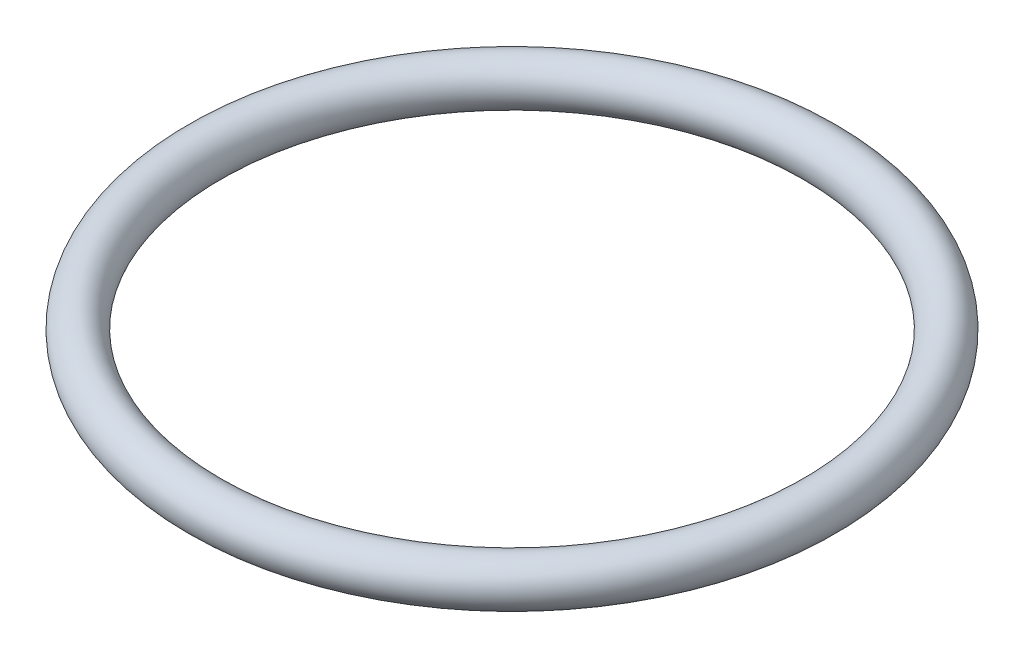
ISO-10303-21;
HEADER;
FILE_DESCRIPTION(('STEP AP214'),'2;1');
FILE_NAME('part.step','',(''),(''),'','','');
FILE_SCHEMA(('AUTOMOTIVE_DESIGN { 1 0 10303 214 1 1 1 1 }'));
ENDSEC;
DATA;
#1=APPLICATION_CONTEXT('core data for automotive mechanical design processes');
#2=APPLICATION_PROTOCOL_DEFINITION('international standard','automotive_design',2000,#1);
#3=PRODUCT_CONTEXT('',#1,'mechanical');
#4=PRODUCT('Part','Part','',(#3));
#5=PRODUCT_RELATED_PRODUCT_CATEGORY('part','',(#4));
#6=PRODUCT_DEFINITION_FORMATION('','',#4);
#7=PRODUCT_DEFINITION_CONTEXT('part definition',#1,'design');
#8=PRODUCT_DEFINITION('design','',#6,#7);
#9=PRODUCT_DEFINITION_SHAPE('','',#8);
#10=(LENGTH_UNIT() NAMED_UNIT(*) SI_UNIT(.MILLI.,.METRE.));
#11=(NAMED_UNIT(*) PLANE_ANGLE_UNIT() SI_UNIT($,.RADIAN.));
#12=(NAMED_UNIT(*) SI_UNIT($,.STERADIAN.) SOLID_ANGLE_UNIT());
#13=UNCERTAINTY_MEASURE_WITH_UNIT(LENGTH_MEASURE(1.E-05),#10,'distance_accuracy_value','');
#14=(GEOMETRIC_REPRESENTATION_CONTEXT(3) GLOBAL_UNCERTAINTY_ASSIGNED_CONTEXT((#13)) GLOBAL_UNIT_ASSIGNED_CONTEXT((#10,
#11,#12)) REPRESENTATION_CONTEXT('',''));
#15=CARTESIAN_POINT('',(0.,0.,0.));
#16=DIRECTION('',(0.,0.,1.));
#17=DIRECTION('',(1.,0.,0.));
#18=AXIS2_PLACEMENT_3D('',#15,#16,#17);
#19=CARTESIAN_POINT('',(0.,0.,0.));
#20=DIRECTION('',(0.,1.,0.));
#21=DIRECTION('',(0.,0.,1.00000000000001));
#22=AXIS2_PLACEMENT_3D('',#19,#20,#21);
#23=TOROIDAL_SURFACE('',#22,17.05,1.25);
#24=CARTESIAN_POINT('',(0.,0.,18.3000000000001));
#25=VERTEX_POINT('',#24);
#26=VERTEX_LOOP('',#25);
#27=FACE_BOUND('',#26,.T.);
#28=ADVANCED_FACE('F13',(#27),#23,.T.);
#29=CLOSED_SHELL('',(#28));
#30=MANIFOLD_SOLID_BREP('B1',#29);
#31=ADVANCED_BREP_SHAPE_REPRESENTATION('',(#18,#30),#14);
#32=SHAPE_DEFINITION_REPRESENTATION(#9,#31);
ENDSEC;
END-ISO-10303-21;
